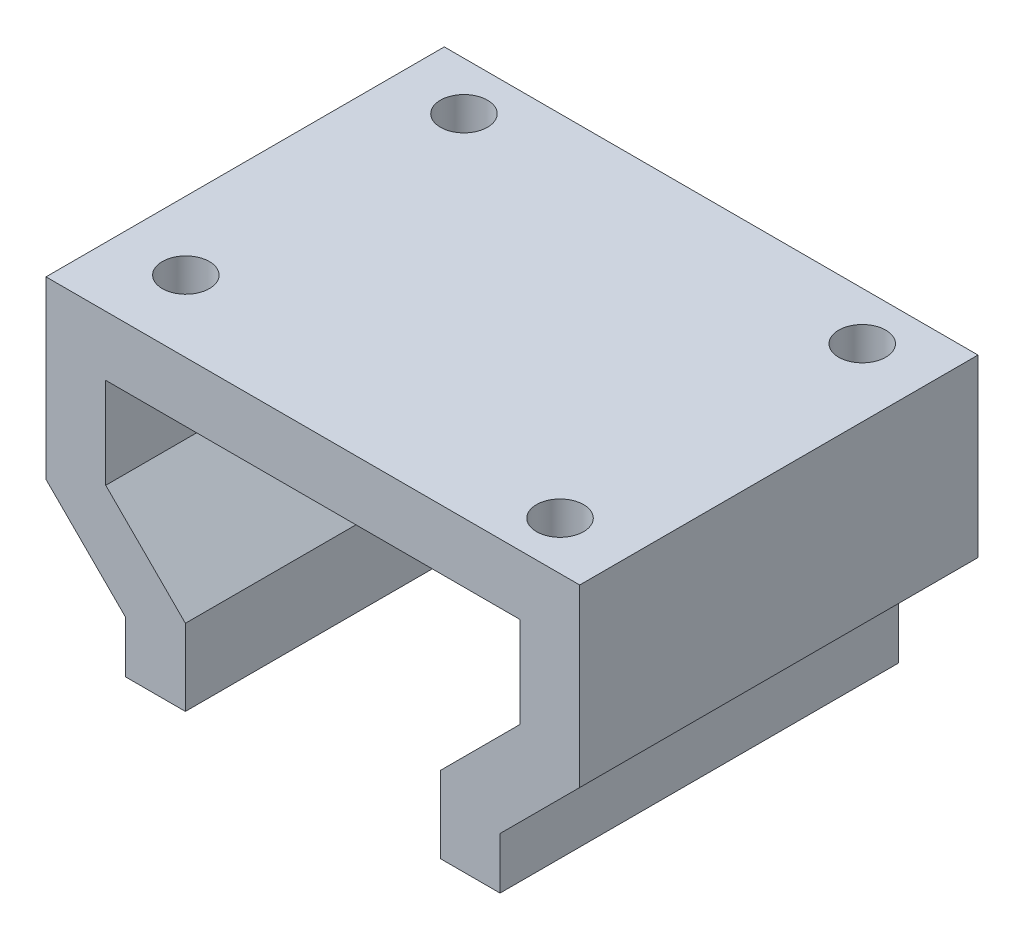
ISO-10303-21;
HEADER;
FILE_DESCRIPTION(('STEP AP214'),'2;1');
FILE_NAME('part.step','',(''),(''),'','','');
FILE_SCHEMA(('AUTOMOTIVE_DESIGN { 1 0 10303 214 1 1 1 1 }'));
ENDSEC;
DATA;
#1=APPLICATION_CONTEXT('core data for automotive mechanical design processes');
#2=APPLICATION_PROTOCOL_DEFINITION('international standard','automotive_design',2000,#1);
#3=PRODUCT_CONTEXT('',#1,'mechanical');
#4=PRODUCT('Part','Part','',(#3));
#5=PRODUCT_RELATED_PRODUCT_CATEGORY('part','',(#4));
#6=PRODUCT_DEFINITION_FORMATION('','',#4);
#7=PRODUCT_DEFINITION_CONTEXT('part definition',#1,'design');
#8=PRODUCT_DEFINITION('design','',#6,#7);
#9=PRODUCT_DEFINITION_SHAPE('','',#8);
#10=(LENGTH_UNIT() NAMED_UNIT(*) SI_UNIT(.MILLI.,.METRE.));
#11=(NAMED_UNIT(*) PLANE_ANGLE_UNIT() SI_UNIT($,.RADIAN.));
#12=(NAMED_UNIT(*) SI_UNIT($,.STERADIAN.) SOLID_ANGLE_UNIT());
#13=UNCERTAINTY_MEASURE_WITH_UNIT(LENGTH_MEASURE(1.E-05),#10,'distance_accuracy_value','');
#14=(GEOMETRIC_REPRESENTATION_CONTEXT(3) GLOBAL_UNCERTAINTY_ASSIGNED_CONTEXT((#13)) GLOBAL_UNIT_ASSIGNED_CONTEXT((#10,
#11,#12)) REPRESENTATION_CONTEXT('',''));
#15=CARTESIAN_POINT('',(0.,0.,0.));
#16=DIRECTION('',(0.,0.,1.));
#17=DIRECTION('',(1.,0.,0.));
#18=AXIS2_PLACEMENT_3D('',#15,#16,#17);
#19=CARTESIAN_POINT('',(-11.938,0.,25.4));
#20=DIRECTION('',(1.,0.,0.));
#21=DIRECTION('',(0.,1.,0.));
#22=AXIS2_PLACEMENT_3D('',#19,#20,#21);
#23=PLANE('',#22);
#24=DIRECTION('',(0.,-1.,0.));
#25=VECTOR('',#24,1.);
#26=CARTESIAN_POINT('',(-11.938,0.,0.));
#27=LINE('',#26,#25);
#28=CARTESIAN_POINT('',(-11.938,0.75142583767298,0.));
#29=VERTEX_POINT('',#28);
#30=CARTESIAN_POINT('',(-11.938,-2.54,0.));
#31=VERTEX_POINT('',#30);
#32=EDGE_CURVE('E194',#29,#31,#27,.T.);
#33=ORIENTED_EDGE('',*,*,#32,.T.);
#34=DIRECTION('',(0.,0.,-1.));
#35=VECTOR('',#34,1.);
#36=CARTESIAN_POINT('',(-11.938,-2.54,25.4));
#37=LINE('',#36,#35);
#38=CARTESIAN_POINT('',(-11.938,-2.54,25.4));
#39=VERTEX_POINT('',#38);
#40=EDGE_CURVE('E11',#39,#31,#37,.T.);
#41=ORIENTED_EDGE('',*,*,#40,.F.);
#42=DIRECTION('',(0.,-1.,0.));
#43=VECTOR('',#42,1.);
#44=CARTESIAN_POINT('',(-11.938,0.,25.4));
#45=LINE('',#44,#43);
#46=CARTESIAN_POINT('',(-11.938,0.75142583767298,25.4));
#47=VERTEX_POINT('',#46);
#48=EDGE_CURVE('E292',#47,#39,#45,.T.);
#49=ORIENTED_EDGE('',*,*,#48,.F.);
#50=DIRECTION('',(0.,0.,-1.));
#51=VECTOR('',#50,1.);
#52=CARTESIAN_POINT('',(-11.938,0.75142583767298,25.4));
#53=LINE('',#52,#51);
#54=EDGE_CURVE('E293',#47,#29,#53,.T.);
#55=ORIENTED_EDGE('',*,*,#54,.T.);
#56=EDGE_LOOP('',(#33,#41,#49,#55));
#57=FACE_BOUND('',#56,.T.);
#58=ADVANCED_FACE('F45',(#57),#23,.F.);
#59=CARTESIAN_POINT('',(0.,-2.54,25.4));
#60=DIRECTION('',(0.,1.,0.));
#61=DIRECTION('',(-1.,0.,0.));
#62=AXIS2_PLACEMENT_3D('',#59,#60,#61);
#63=PLANE('',#62);
#64=DIRECTION('',(1.,0.,0.));
#65=VECTOR('',#64,1.);
#66=CARTESIAN_POINT('',(0.,-2.54,0.));
#67=LINE('',#66,#65);
#68=CARTESIAN_POINT('',(-8.128,-2.54,0.));
#69=VERTEX_POINT('',#68);
#70=EDGE_CURVE('E236',#31,#69,#67,.T.);
#71=ORIENTED_EDGE('',*,*,#70,.T.);
#72=DIRECTION('',(0.,0.,-1.));
#73=VECTOR('',#72,1.);
#74=CARTESIAN_POINT('',(-8.128,-2.54,25.4));
#75=LINE('',#74,#73);
#76=CARTESIAN_POINT('',(-8.128,-2.54,25.4));
#77=VERTEX_POINT('',#76);
#78=EDGE_CURVE('E53',#77,#69,#75,.T.);
#79=ORIENTED_EDGE('',*,*,#78,.F.);
#80=DIRECTION('',(1.,0.,0.));
#81=VECTOR('',#80,1.);
#82=CARTESIAN_POINT('',(0.,-2.54,25.4));
#83=LINE('',#82,#81);
#84=EDGE_CURVE('E375',#39,#77,#83,.T.);
#85=ORIENTED_EDGE('',*,*,#84,.F.);
#86=ORIENTED_EDGE('',*,*,#40,.T.);
#87=EDGE_LOOP('',(#71,#79,#85,#86));
#88=FACE_BOUND('',#87,.T.);
#89=ADVANCED_FACE('F237',(#88),#63,.F.);
#90=CARTESIAN_POINT('',(-8.128,0.,25.4));
#91=DIRECTION('',(1.,0.,0.));
#92=DIRECTION('',(0.,1.,0.));
#93=AXIS2_PLACEMENT_3D('',#90,#91,#92);
#94=PLANE('',#93);
#95=DIRECTION('',(0.,-1.,0.));
#96=VECTOR('',#95,1.);
#97=CARTESIAN_POINT('',(-8.128,0.,0.));
#98=LINE('',#97,#96);
#99=CARTESIAN_POINT('',(-8.128,2.32957951031447,0.));
#100=VERTEX_POINT('',#99);
#101=EDGE_CURVE('E231',#100,#69,#98,.T.);
#102=ORIENTED_EDGE('',*,*,#101,.F.);
#103=DIRECTION('',(0.,0.,-1.));
#104=VECTOR('',#103,1.);
#105=CARTESIAN_POINT('',(-8.128,2.32957951031447,25.4));
#106=LINE('',#105,#104);
#107=CARTESIAN_POINT('',(-8.128,2.32957951031447,25.4));
#108=VERTEX_POINT('',#107);
#109=EDGE_CURVE('E221',#108,#100,#106,.T.);
#110=ORIENTED_EDGE('',*,*,#109,.F.);
#111=DIRECTION('',(0.,-1.,0.));
#112=VECTOR('',#111,1.);
#113=CARTESIAN_POINT('',(-8.128,0.,25.4));
#114=LINE('',#113,#112);
#115=EDGE_CURVE('E234',#108,#77,#114,.T.);
#116=ORIENTED_EDGE('',*,*,#115,.T.);
#117=ORIENTED_EDGE('',*,*,#78,.T.);
#118=EDGE_LOOP('',(#102,#110,#116,#117));
#119=FACE_BOUND('',#118,.T.);
#120=ADVANCED_FACE('F229',(#119),#94,.T.);
#121=CARTESIAN_POINT('',(-2.89921024484276,-2.89921024484276,25.4));
#122=DIRECTION('',(0.707106781186548,0.707106781186548,0.));
#123=DIRECTION('',(-0.707106781186548,0.707106781186548,0.));
#124=AXIS2_PLACEMENT_3D('',#121,#122,#123);
#125=PLANE('',#124);
#126=DIRECTION('',(0.707106781186548,-0.707106781186548,0.));
#127=VECTOR('',#126,1.);
#128=CARTESIAN_POINT('',(-2.89921024484276,-2.89921024484276,0.));
#129=LINE('',#128,#127);
#130=CARTESIAN_POINT('',(-13.208,7.40957951031447,0.));
#131=VERTEX_POINT('',#130);
#132=EDGE_CURVE('E248',#131,#100,#129,.T.);
#133=ORIENTED_EDGE('',*,*,#132,.F.);
#134=DIRECTION('',(0.,0.,-1.));
#135=VECTOR('',#134,1.);
#136=CARTESIAN_POINT('',(-13.208,7.40957951031447,25.4));
#137=LINE('',#136,#135);
#138=CARTESIAN_POINT('',(-13.208,7.40957951031447,25.4));
#139=VERTEX_POINT('',#138);
#140=EDGE_CURVE('E216',#139,#131,#137,.T.);
#141=ORIENTED_EDGE('',*,*,#140,.F.);
#142=DIRECTION('',(0.707106781186548,-0.707106781186548,0.));
#143=VECTOR('',#142,1.);
#144=CARTESIAN_POINT('',(-2.89921024484276,-2.89921024484276,25.4));
#145=LINE('',#144,#143);
#146=EDGE_CURVE('E381',#139,#108,#145,.T.);
#147=ORIENTED_EDGE('',*,*,#146,.T.);
#148=ORIENTED_EDGE('',*,*,#109,.T.);
#149=EDGE_LOOP('',(#133,#141,#147,#148));
#150=FACE_BOUND('',#149,.T.);
#151=ADVANCED_FACE('F484',(#150),#125,.T.);
#152=CARTESIAN_POINT('',(-13.208,0.,25.4));
#153=DIRECTION('',(1.,0.,0.));
#154=DIRECTION('',(0.,0.,-1.));
#155=AXIS2_PLACEMENT_3D('',#152,#153,#154);
#156=PLANE('',#155);
#157=DIRECTION('',(0.,-1.,0.));
#158=VECTOR('',#157,1.);
#159=CARTESIAN_POINT('',(-13.208,0.,0.));
#160=LINE('',#159,#158);
#161=CARTESIAN_POINT('',(-13.208,13.208,0.));
#162=VERTEX_POINT('',#161);
#163=EDGE_CURVE('E252',#162,#131,#160,.T.);
#164=ORIENTED_EDGE('',*,*,#163,.F.);
#165=DIRECTION('',(0.,0.,-1.));
#166=VECTOR('',#165,1.);
#167=CARTESIAN_POINT('',(-13.208,13.208,25.4));
#168=LINE('',#167,#166);
#169=CARTESIAN_POINT('',(-13.208,13.208,1.6526680616966));
#170=VERTEX_POINT('',#169);
#171=EDGE_CURVE('E201',#170,#162,#168,.T.);
#172=ORIENTED_EDGE('',*,*,#171,.F.);
#173=CARTESIAN_POINT('',(-13.208,13.208,4.47538731801665));
#174=VERTEX_POINT('',#173);
#175=EDGE_CURVE('E192',#174,#170,#168,.T.);
#176=ORIENTED_EDGE('',*,*,#175,.F.);
#177=CARTESIAN_POINT('',(-13.208,13.208,19.4491786997328));
#178=VERTEX_POINT('',#177);
#179=EDGE_CURVE('E200',#178,#174,#168,.T.);
#180=ORIENTED_EDGE('',*,*,#179,.F.);
#181=CARTESIAN_POINT('',(-13.208,13.208,22.2387684953691));
#182=VERTEX_POINT('',#181);
#183=EDGE_CURVE('E210',#182,#178,#168,.T.);
#184=ORIENTED_EDGE('',*,*,#183,.F.);
#185=CARTESIAN_POINT('',(-13.208,13.208,25.4));
#186=VERTEX_POINT('',#185);
#187=EDGE_CURVE('E212',#186,#182,#168,.T.);
#188=ORIENTED_EDGE('',*,*,#187,.F.);
#189=DIRECTION('',(0.,-1.,0.));
#190=VECTOR('',#189,1.);
#191=CARTESIAN_POINT('',(-13.208,0.,25.4));
#192=LINE('',#191,#190);
#193=EDGE_CURVE('E385',#186,#139,#192,.T.);
#194=ORIENTED_EDGE('',*,*,#193,.T.);
#195=ORIENTED_EDGE('',*,*,#140,.T.);
#196=EDGE_LOOP('',(#164,#172,#176,#180,#184,#188,#194,#195));
#197=FACE_BOUND('',#196,.T.);
#198=ADVANCED_FACE('F198',(#197),#156,.T.);
#199=CARTESIAN_POINT('',(0.,13.208,25.4));
#200=DIRECTION('',(0.,-1.,0.));
#201=DIRECTION('',(0.,0.,-1.));
#202=AXIS2_PLACEMENT_3D('',#199,#200,#201);
#203=PLANE('',#202);
#204=CARTESIAN_POINT('',(12.7,13.208,3.06402768985662));
#205=DIRECTION('',(0.,1.,0.));
#206=DIRECTION('',(0.,0.,1.));
#207=AXIS2_PLACEMENT_3D('',#204,#205,#206);
#208=CIRCLE('',#207,1.5);
#209=CARTESIAN_POINT('',(13.208,13.208,1.6526680616966));
#210=VERTEX_POINT('',#209);
#211=CARTESIAN_POINT('',(13.208,13.208,4.47538731801665));
#212=VERTEX_POINT('',#211);
#213=EDGE_CURVE('E356',#210,#212,#208,.T.);
#214=ORIENTED_EDGE('',*,*,#213,.T.);
#215=DIRECTION('',(0.,0.,-1.));
#216=VECTOR('',#215,1.);
#217=CARTESIAN_POINT('',(13.208,13.208,25.4));
#218=LINE('',#217,#216);
#219=CARTESIAN_POINT('',(13.208,13.208,20.9246126819834));
#220=VERTEX_POINT('',#219);
#221=EDGE_CURVE('E340',#220,#212,#218,.T.);
#222=ORIENTED_EDGE('',*,*,#221,.F.);
#223=CARTESIAN_POINT('',(12.7,13.208,22.3359723101434));
#224=DIRECTION('',(0.,1.,0.));
#225=DIRECTION('',(0.,0.,1.));
#226=AXIS2_PLACEMENT_3D('',#223,#224,#225);
#227=CIRCLE('',#226,1.5);
#228=CARTESIAN_POINT('',(13.208,13.208,23.7473319383034));
#229=VERTEX_POINT('',#228);
#230=EDGE_CURVE('E354',#220,#229,#227,.T.);
#231=ORIENTED_EDGE('',*,*,#230,.T.);
#232=CARTESIAN_POINT('',(13.208,13.208,25.4));
#233=VERTEX_POINT('',#232);
#234=EDGE_CURVE('E217',#233,#229,#218,.T.);
#235=ORIENTED_EDGE('',*,*,#234,.F.);
#236=DIRECTION('',(-1.,0.,0.));
#237=VECTOR('',#236,1.);
#238=CARTESIAN_POINT('',(0.,13.208,25.4));
#239=LINE('',#238,#237);
#240=EDGE_CURVE('E389',#233,#186,#239,.T.);
#241=ORIENTED_EDGE('',*,*,#240,.T.);
#242=ORIENTED_EDGE('',*,*,#187,.T.);
#243=CARTESIAN_POINT('',(-12.6561420535858,13.208,20.8439735975509));
#244=DIRECTION('',(0.,1.,0.));
#245=DIRECTION('',(0.,0.,1.));
#246=AXIS2_PLACEMENT_3D('',#243,#244,#245);
#247=CIRCLE('',#246,1.5);
#248=EDGE_CURVE('E208',#182,#178,#247,.T.);
#249=ORIENTED_EDGE('',*,*,#248,.T.);
#250=ORIENTED_EDGE('',*,*,#179,.T.);
#251=CARTESIAN_POINT('',(-12.7,13.208,3.06402768985662));
#252=DIRECTION('',(0.,1.,0.));
#253=DIRECTION('',(0.,0.,1.));
#254=AXIS2_PLACEMENT_3D('',#251,#252,#253);
#255=CIRCLE('',#254,1.5);
#256=EDGE_CURVE('E180',#174,#170,#255,.T.);
#257=ORIENTED_EDGE('',*,*,#256,.T.);
#258=ORIENTED_EDGE('',*,*,#171,.T.);
#259=DIRECTION('',(-1.,0.,0.));
#260=VECTOR('',#259,1.);
#261=CARTESIAN_POINT('',(0.,13.208,0.));
#262=LINE('',#261,#260);
#263=CARTESIAN_POINT('',(13.208,13.208,0.));
#264=VERTEX_POINT('',#263);
#265=EDGE_CURVE('E258',#264,#162,#262,.T.);
#266=ORIENTED_EDGE('',*,*,#265,.F.);
#267=EDGE_CURVE('E328',#210,#264,#218,.T.);
#268=ORIENTED_EDGE('',*,*,#267,.F.);
#269=EDGE_LOOP('',(#214,#222,#231,#235,#241,#242,#249,#250,#257,#258,#266,#268));
#270=FACE_BOUND('',#269,.T.);
#271=ADVANCED_FACE('F206',(#270),#203,.T.);
#272=CARTESIAN_POINT('',(13.208,0.,25.4));
#273=DIRECTION('',(1.,0.,0.));
#274=DIRECTION('',(0.,0.,-1.));
#275=AXIS2_PLACEMENT_3D('',#272,#273,#274);
#276=PLANE('',#275);
#277=DIRECTION('',(0.,-1.,0.));
#278=VECTOR('',#277,1.);
#279=CARTESIAN_POINT('',(13.208,0.,0.));
#280=LINE('',#279,#278);
#281=CARTESIAN_POINT('',(13.208,7.40957951031447,0.));
#282=VERTEX_POINT('',#281);
#283=EDGE_CURVE('E262',#264,#282,#280,.T.);
#284=ORIENTED_EDGE('',*,*,#283,.T.);
#285=DIRECTION('',(0.,0.,-1.));
#286=VECTOR('',#285,1.);
#287=CARTESIAN_POINT('',(13.208,7.40957951031447,25.4));
#288=LINE('',#287,#286);
#289=CARTESIAN_POINT('',(13.208,7.40957951031447,25.4));
#290=VERTEX_POINT('',#289);
#291=EDGE_CURVE('E325',#290,#282,#288,.T.);
#292=ORIENTED_EDGE('',*,*,#291,.F.);
#293=DIRECTION('',(0.,-1.,0.));
#294=VECTOR('',#293,1.);
#295=CARTESIAN_POINT('',(13.208,0.,25.4));
#296=LINE('',#295,#294);
#297=EDGE_CURVE('E393',#233,#290,#296,.T.);
#298=ORIENTED_EDGE('',*,*,#297,.F.);
#299=ORIENTED_EDGE('',*,*,#234,.T.);
#300=EDGE_CURVE('E343',#229,#220,#218,.T.);
#301=ORIENTED_EDGE('',*,*,#300,.T.);
#302=ORIENTED_EDGE('',*,*,#221,.T.);
#303=EDGE_CURVE('E334',#212,#210,#218,.T.);
#304=ORIENTED_EDGE('',*,*,#303,.T.);
#305=ORIENTED_EDGE('',*,*,#267,.T.);
#306=EDGE_LOOP('',(#284,#292,#298,#299,#301,#302,#304,#305));
#307=FACE_BOUND('',#306,.T.);
#308=ADVANCED_FACE('F351',(#307),#276,.F.);
#309=CARTESIAN_POINT('',(2.89921024484277,-2.89921024484277,25.4));
#310=DIRECTION('',(0.707106781186548,-0.707106781186548,0.));
#311=DIRECTION('',(0.707106781186548,0.707106781186548,0.));
#312=AXIS2_PLACEMENT_3D('',#309,#310,#311);
#313=PLANE('',#312);
#314=DIRECTION('',(-0.707106781186548,-0.707106781186548,0.));
#315=VECTOR('',#314,1.);
#316=CARTESIAN_POINT('',(2.89921024484277,-2.89921024484277,0.));
#317=LINE('',#316,#315);
#318=CARTESIAN_POINT('',(8.128,2.32957951031447,0.));
#319=VERTEX_POINT('',#318);
#320=EDGE_CURVE('E265',#282,#319,#317,.T.);
#321=ORIENTED_EDGE('',*,*,#320,.T.);
#322=DIRECTION('',(0.,0.,-1.));
#323=VECTOR('',#322,1.);
#324=CARTESIAN_POINT('',(8.128,2.32957951031447,25.4));
#325=LINE('',#324,#323);
#326=CARTESIAN_POINT('',(8.128,2.32957951031447,25.4));
#327=VERTEX_POINT('',#326);
#328=EDGE_CURVE('E322',#327,#319,#325,.T.);
#329=ORIENTED_EDGE('',*,*,#328,.F.);
#330=DIRECTION('',(-0.707106781186548,-0.707106781186548,0.));
#331=VECTOR('',#330,1.);
#332=CARTESIAN_POINT('',(2.89921024484277,-2.89921024484277,25.4));
#333=LINE('',#332,#331);
#334=EDGE_CURVE('E396',#290,#327,#333,.T.);
#335=ORIENTED_EDGE('',*,*,#334,.F.);
#336=ORIENTED_EDGE('',*,*,#291,.T.);
#337=EDGE_LOOP('',(#321,#329,#335,#336));
#338=FACE_BOUND('',#337,.T.);
#339=ADVANCED_FACE('F467',(#338),#313,.F.);
#340=CARTESIAN_POINT('',(8.12800000000001,0.,25.4));
#341=DIRECTION('',(1.,0.,0.));
#342=DIRECTION('',(0.,1.,0.));
#343=AXIS2_PLACEMENT_3D('',#340,#341,#342);
#344=PLANE('',#343);
#345=DIRECTION('',(0.,-1.,0.));
#346=VECTOR('',#345,1.);
#347=CARTESIAN_POINT('',(8.12800000000001,0.,0.));
#348=LINE('',#347,#346);
#349=CARTESIAN_POINT('',(8.12800000000001,-2.54,0.));
#350=VERTEX_POINT('',#349);
#351=EDGE_CURVE('E268',#319,#350,#348,.T.);
#352=ORIENTED_EDGE('',*,*,#351,.T.);
#353=DIRECTION('',(0.,0.,-1.));
#354=VECTOR('',#353,1.);
#355=CARTESIAN_POINT('',(8.12800000000001,-2.54,25.4));
#356=LINE('',#355,#354);
#357=CARTESIAN_POINT('',(8.12800000000001,-2.54,25.4));
#358=VERTEX_POINT('',#357);
#359=EDGE_CURVE('E318',#358,#350,#356,.T.);
#360=ORIENTED_EDGE('',*,*,#359,.F.);
#361=DIRECTION('',(0.,-1.,0.));
#362=VECTOR('',#361,1.);
#363=CARTESIAN_POINT('',(8.12800000000001,0.,25.4));
#364=LINE('',#363,#362);
#365=EDGE_CURVE('E399',#327,#358,#364,.T.);
#366=ORIENTED_EDGE('',*,*,#365,.F.);
#367=ORIENTED_EDGE('',*,*,#328,.T.);
#368=EDGE_LOOP('',(#352,#360,#366,#367));
#369=FACE_BOUND('',#368,.T.);
#370=ADVANCED_FACE('F466',(#369),#344,.F.);
#371=CARTESIAN_POINT('',(11.938,-2.54,0.));
#372=VERTEX_POINT('',#371);
#373=EDGE_CURVE('E244',#350,#372,#67,.T.);
#374=ORIENTED_EDGE('',*,*,#373,.T.);
#375=DIRECTION('',(0.,0.,-1.));
#376=VECTOR('',#375,1.);
#377=CARTESIAN_POINT('',(11.938,-2.54,25.4));
#378=LINE('',#377,#376);
#379=CARTESIAN_POINT('',(11.938,-2.54,25.4));
#380=VERTEX_POINT('',#379);
#381=EDGE_CURVE('E315',#380,#372,#378,.T.);
#382=ORIENTED_EDGE('',*,*,#381,.F.);
#383=EDGE_CURVE('E378',#358,#380,#83,.T.);
#384=ORIENTED_EDGE('',*,*,#383,.F.);
#385=ORIENTED_EDGE('',*,*,#359,.T.);
#386=EDGE_LOOP('',(#374,#382,#384,#385));
#387=FACE_BOUND('',#386,.T.);
#388=ADVANCED_FACE('F457',(#387),#63,.F.);
#389=CARTESIAN_POINT('',(11.938,0.,25.4));
#390=DIRECTION('',(1.,0.,0.));
#391=DIRECTION('',(0.,1.,0.));
#392=AXIS2_PLACEMENT_3D('',#389,#390,#391);
#393=PLANE('',#392);
#394=DIRECTION('',(0.,-1.,0.));
#395=VECTOR('',#394,1.);
#396=CARTESIAN_POINT('',(11.938,0.,0.));
#397=LINE('',#396,#395);
#398=CARTESIAN_POINT('',(11.938,0.75142583767298,0.));
#399=VERTEX_POINT('',#398);
#400=EDGE_CURVE('E271',#399,#372,#397,.T.);
#401=ORIENTED_EDGE('',*,*,#400,.F.);
#402=DIRECTION('',(0.,0.,-1.));
#403=VECTOR('',#402,1.);
#404=CARTESIAN_POINT('',(11.938,0.75142583767298,25.4));
#405=LINE('',#404,#403);
#406=CARTESIAN_POINT('',(11.938,0.75142583767298,25.4));
#407=VERTEX_POINT('',#406);
#408=EDGE_CURVE('E312',#407,#399,#405,.T.);
#409=ORIENTED_EDGE('',*,*,#408,.F.);
#410=DIRECTION('',(0.,-1.,0.));
#411=VECTOR('',#410,1.);
#412=CARTESIAN_POINT('',(11.938,0.,25.4));
#413=LINE('',#412,#411);
#414=EDGE_CURVE('E402',#407,#380,#413,.T.);
#415=ORIENTED_EDGE('',*,*,#414,.T.);
#416=ORIENTED_EDGE('',*,*,#381,.T.);
#417=EDGE_LOOP('',(#401,#409,#415,#416));
#418=FACE_BOUND('',#417,.T.);
#419=ADVANCED_FACE('F452',(#418),#393,.T.);
#420=CARTESIAN_POINT('',(5.59328708116351,-5.59328708116351,25.4));
#421=DIRECTION('',(0.707106781186548,-0.707106781186548,0.));
#422=DIRECTION('',(0.707106781186548,0.707106781186548,0.));
#423=AXIS2_PLACEMENT_3D('',#420,#421,#422);
#424=PLANE('',#423);
#425=DIRECTION('',(-0.707106781186548,-0.707106781186548,0.));
#426=VECTOR('',#425,1.);
#427=CARTESIAN_POINT('',(5.59328708116351,-5.59328708116351,0.));
#428=LINE('',#427,#426);
#429=CARTESIAN_POINT('',(17.018,5.83142583767298,0.));
#430=VERTEX_POINT('',#429);
#431=EDGE_CURVE('E275',#430,#399,#428,.T.);
#432=ORIENTED_EDGE('',*,*,#431,.F.);
#433=DIRECTION('',(0.,0.,-1.));
#434=VECTOR('',#433,1.);
#435=CARTESIAN_POINT('',(17.018,5.83142583767298,25.4));
#436=LINE('',#435,#434);
#437=CARTESIAN_POINT('',(17.018,5.83142583767298,25.4));
#438=VERTEX_POINT('',#437);
#439=EDGE_CURVE('E309',#438,#430,#436,.T.);
#440=ORIENTED_EDGE('',*,*,#439,.F.);
#441=DIRECTION('',(-0.707106781186548,-0.707106781186548,0.));
#442=VECTOR('',#441,1.);
#443=CARTESIAN_POINT('',(5.59328708116351,-5.59328708116351,25.4));
#444=LINE('',#443,#442);
#445=EDGE_CURVE('E406',#438,#407,#444,.T.);
#446=ORIENTED_EDGE('',*,*,#445,.T.);
#447=ORIENTED_EDGE('',*,*,#408,.T.);
#448=EDGE_LOOP('',(#432,#440,#446,#447));
#449=FACE_BOUND('',#448,.T.);
#450=ADVANCED_FACE('F446',(#449),#424,.T.);
#451=CARTESIAN_POINT('',(17.018,0.,25.4));
#452=DIRECTION('',(1.,0.,0.));
#453=DIRECTION('',(0.,0.,-1.));
#454=AXIS2_PLACEMENT_3D('',#451,#452,#453);
#455=PLANE('',#454);
#456=DIRECTION('',(0.,-1.,0.));
#457=VECTOR('',#456,1.);
#458=CARTESIAN_POINT('',(17.018,0.,0.));
#459=LINE('',#458,#457);
#460=CARTESIAN_POINT('',(17.018,17.018,0.));
#461=VERTEX_POINT('',#460);
#462=EDGE_CURVE('E279',#461,#430,#459,.T.);
#463=ORIENTED_EDGE('',*,*,#462,.F.);
#464=DIRECTION('',(0.,0.,-1.));
#465=VECTOR('',#464,1.);
#466=CARTESIAN_POINT('',(17.018,17.018,25.4));
#467=LINE('',#466,#465);
#468=CARTESIAN_POINT('',(17.018,17.018,25.4));
#469=VERTEX_POINT('',#468);
#470=EDGE_CURVE('E306',#469,#461,#467,.T.);
#471=ORIENTED_EDGE('',*,*,#470,.F.);
#472=DIRECTION('',(0.,-1.,0.));
#473=VECTOR('',#472,1.);
#474=CARTESIAN_POINT('',(17.018,0.,25.4));
#475=LINE('',#474,#473);
#476=EDGE_CURVE('E410',#469,#438,#475,.T.);
#477=ORIENTED_EDGE('',*,*,#476,.T.);
#478=ORIENTED_EDGE('',*,*,#439,.T.);
#479=EDGE_LOOP('',(#463,#471,#477,#478));
#480=FACE_BOUND('',#479,.T.);
#481=ADVANCED_FACE('F442',(#480),#455,.T.);
#482=CARTESIAN_POINT('',(0.,17.018,25.4));
#483=DIRECTION('',(0.,-1.,0.));
#484=DIRECTION('',(0.,0.,-1.));
#485=AXIS2_PLACEMENT_3D('',#482,#483,#484);
#486=PLANE('',#485);
#487=CARTESIAN_POINT('',(12.7,17.018,3.06402768985662));
#488=DIRECTION('',(0.,1.,0.));
#489=DIRECTION('',(0.,0.,1.));
#490=AXIS2_PLACEMENT_3D('',#487,#488,#489);
#491=CIRCLE('',#490,1.5);
#492=CARTESIAN_POINT('',(12.7,17.018,4.56402768985662));
#493=VERTEX_POINT('',#492);
#494=EDGE_CURVE('E364',#493,#493,#491,.T.);
#495=ORIENTED_EDGE('',*,*,#494,.F.);
#496=EDGE_LOOP('',(#495));
#497=FACE_BOUND('',#496,.T.);
#498=CARTESIAN_POINT('',(12.7,17.018,22.3359723101434));
#499=DIRECTION('',(0.,1.,0.));
#500=DIRECTION('',(0.,0.,1.));
#501=AXIS2_PLACEMENT_3D('',#498,#499,#500);
#502=CIRCLE('',#501,1.5);
#503=CARTESIAN_POINT('',(12.7,17.018,23.8359723101434));
#504=VERTEX_POINT('',#503);
#505=EDGE_CURVE('E544',#504,#504,#502,.T.);
#506=ORIENTED_EDGE('',*,*,#505,.F.);
#507=EDGE_LOOP('',(#506));
#508=FACE_BOUND('',#507,.T.);
#509=CARTESIAN_POINT('',(-12.6561420535858,17.018,20.8439735975509));
#510=DIRECTION('',(0.,1.,0.));
#511=DIRECTION('',(0.,0.,1.));
#512=AXIS2_PLACEMENT_3D('',#509,#510,#511);
#513=CIRCLE('',#512,1.5);
#514=CARTESIAN_POINT('',(-12.6561420535858,17.018,22.3439735975509));
#515=VERTEX_POINT('',#514);
#516=EDGE_CURVE('E371',#515,#515,#513,.T.);
#517=ORIENTED_EDGE('',*,*,#516,.F.);
#518=EDGE_LOOP('',(#517));
#519=FACE_BOUND('',#518,.T.);
#520=CARTESIAN_POINT('',(-12.7,17.018,3.06402768985662));
#521=DIRECTION('',(0.,1.,0.));
#522=DIRECTION('',(0.,0.,1.));
#523=AXIS2_PLACEMENT_3D('',#520,#521,#522);
#524=CIRCLE('',#523,1.5);
#525=CARTESIAN_POINT('',(-12.7,17.018,4.56402768985662));
#526=VERTEX_POINT('',#525);
#527=EDGE_CURVE('E187',#526,#526,#524,.T.);
#528=ORIENTED_EDGE('',*,*,#527,.F.);
#529=EDGE_LOOP('',(#528));
#530=FACE_BOUND('',#529,.T.);
#531=DIRECTION('',(-1.,0.,0.));
#532=VECTOR('',#531,1.);
#533=CARTESIAN_POINT('',(0.,17.018,0.));
#534=LINE('',#533,#532);
#535=CARTESIAN_POINT('',(-17.018,17.018,0.));
#536=VERTEX_POINT('',#535);
#537=EDGE_CURVE('E283',#461,#536,#534,.T.);
#538=ORIENTED_EDGE('',*,*,#537,.T.);
#539=DIRECTION('',(0.,0.,-1.));
#540=VECTOR('',#539,1.);
#541=CARTESIAN_POINT('',(-17.018,17.018,25.4));
#542=LINE('',#541,#540);
#543=CARTESIAN_POINT('',(-17.018,17.018,25.4));
#544=VERTEX_POINT('',#543);
#545=EDGE_CURVE('E302',#544,#536,#542,.T.);
#546=ORIENTED_EDGE('',*,*,#545,.F.);
#547=DIRECTION('',(-1.,0.,0.));
#548=VECTOR('',#547,1.);
#549=CARTESIAN_POINT('',(0.,17.018,25.4));
#550=LINE('',#549,#548);
#551=EDGE_CURVE('E414',#469,#544,#550,.T.);
#552=ORIENTED_EDGE('',*,*,#551,.F.);
#553=ORIENTED_EDGE('',*,*,#470,.T.);
#554=EDGE_LOOP('',(#538,#546,#552,#553));
#555=FACE_BOUND('',#554,.T.);
#556=ADVANCED_FACE('F438',(#497,#508,#519,#530,#555),#486,.F.);
#557=CARTESIAN_POINT('',(-17.018,0.,25.4));
#558=DIRECTION('',(1.,0.,0.));
#559=DIRECTION('',(0.,0.,-1.));
#560=AXIS2_PLACEMENT_3D('',#557,#558,#559);
#561=PLANE('',#560);
#562=DIRECTION('',(0.,-1.,0.));
#563=VECTOR('',#562,1.);
#564=CARTESIAN_POINT('',(-17.018,0.,0.));
#565=LINE('',#564,#563);
#566=CARTESIAN_POINT('',(-17.018,5.83142583767298,0.));
#567=VERTEX_POINT('',#566);
#568=EDGE_CURVE('E286',#536,#567,#565,.T.);
#569=ORIENTED_EDGE('',*,*,#568,.T.);
#570=DIRECTION('',(0.,0.,-1.));
#571=VECTOR('',#570,1.);
#572=CARTESIAN_POINT('',(-17.018,5.83142583767298,25.4));
#573=LINE('',#572,#571);
#574=CARTESIAN_POINT('',(-17.018,5.83142583767298,25.4));
#575=VERTEX_POINT('',#574);
#576=EDGE_CURVE('E297',#575,#567,#573,.T.);
#577=ORIENTED_EDGE('',*,*,#576,.F.);
#578=DIRECTION('',(0.,-1.,0.));
#579=VECTOR('',#578,1.);
#580=CARTESIAN_POINT('',(-17.018,0.,25.4));
#581=LINE('',#580,#579);
#582=EDGE_CURVE('E417',#544,#575,#581,.T.);
#583=ORIENTED_EDGE('',*,*,#582,.F.);
#584=ORIENTED_EDGE('',*,*,#545,.T.);
#585=EDGE_LOOP('',(#569,#577,#583,#584));
#586=FACE_BOUND('',#585,.T.);
#587=ADVANCED_FACE('F434',(#586),#561,.F.);
#588=CARTESIAN_POINT('',(-5.59328708116351,-5.59328708116351,25.4));
#589=DIRECTION('',(0.707106781186548,0.707106781186548,0.));
#590=DIRECTION('',(-0.707106781186548,0.707106781186548,0.));
#591=AXIS2_PLACEMENT_3D('',#588,#589,#590);
#592=PLANE('',#591);
#593=DIRECTION('',(0.707106781186548,-0.707106781186548,0.));
#594=VECTOR('',#593,1.);
#595=CARTESIAN_POINT('',(-5.59328708116351,-5.59328708116351,0.));
#596=LINE('',#595,#594);
#597=EDGE_CURVE('E289',#567,#29,#596,.T.);
#598=ORIENTED_EDGE('',*,*,#597,.T.);
#599=ORIENTED_EDGE('',*,*,#54,.F.);
#600=DIRECTION('',(0.707106781186548,-0.707106781186548,0.));
#601=VECTOR('',#600,1.);
#602=CARTESIAN_POINT('',(-5.59328708116351,-5.59328708116351,25.4));
#603=LINE('',#602,#601);
#604=EDGE_CURVE('E298',#575,#47,#603,.T.);
#605=ORIENTED_EDGE('',*,*,#604,.F.);
#606=ORIENTED_EDGE('',*,*,#576,.T.);
#607=EDGE_LOOP('',(#598,#599,#605,#606));
#608=FACE_BOUND('',#607,.T.);
#609=ADVANCED_FACE('F429',(#608),#592,.F.);
#610=CARTESIAN_POINT('',(0.,0.,25.4));
#611=DIRECTION('',(0.,0.,1.));
#612=DIRECTION('',(1.,0.,0.));
#613=AXIS2_PLACEMENT_3D('',#610,#611,#612);
#614=PLANE('',#613);
#615=ORIENTED_EDGE('',*,*,#48,.T.);
#616=ORIENTED_EDGE('',*,*,#84,.T.);
#617=ORIENTED_EDGE('',*,*,#115,.F.);
#618=ORIENTED_EDGE('',*,*,#146,.F.);
#619=ORIENTED_EDGE('',*,*,#193,.F.);
#620=ORIENTED_EDGE('',*,*,#240,.F.);
#621=ORIENTED_EDGE('',*,*,#297,.T.);
#622=ORIENTED_EDGE('',*,*,#334,.T.);
#623=ORIENTED_EDGE('',*,*,#365,.T.);
#624=ORIENTED_EDGE('',*,*,#383,.T.);
#625=ORIENTED_EDGE('',*,*,#414,.F.);
#626=ORIENTED_EDGE('',*,*,#445,.F.);
#627=ORIENTED_EDGE('',*,*,#476,.F.);
#628=ORIENTED_EDGE('',*,*,#551,.T.);
#629=ORIENTED_EDGE('',*,*,#582,.T.);
#630=ORIENTED_EDGE('',*,*,#604,.T.);
#631=EDGE_LOOP('',(#615,#616,#617,#618,#619,#620,#621,#622,#623,#624,#625,#626,#627,#628,#629,#630));
#632=FACE_BOUND('',#631,.T.);
#633=ADVANCED_FACE('F462',(#632),#614,.T.);
#634=CARTESIAN_POINT('',(0.,0.,0.));
#635=DIRECTION('',(0.,0.,1.));
#636=DIRECTION('',(1.,0.,0.));
#637=AXIS2_PLACEMENT_3D('',#634,#635,#636);
#638=PLANE('',#637);
#639=ORIENTED_EDGE('',*,*,#32,.F.);
#640=ORIENTED_EDGE('',*,*,#597,.F.);
#641=ORIENTED_EDGE('',*,*,#568,.F.);
#642=ORIENTED_EDGE('',*,*,#537,.F.);
#643=ORIENTED_EDGE('',*,*,#462,.T.);
#644=ORIENTED_EDGE('',*,*,#431,.T.);
#645=ORIENTED_EDGE('',*,*,#400,.T.);
#646=ORIENTED_EDGE('',*,*,#373,.F.);
#647=ORIENTED_EDGE('',*,*,#351,.F.);
#648=ORIENTED_EDGE('',*,*,#320,.F.);
#649=ORIENTED_EDGE('',*,*,#283,.F.);
#650=ORIENTED_EDGE('',*,*,#265,.T.);
#651=ORIENTED_EDGE('',*,*,#163,.T.);
#652=ORIENTED_EDGE('',*,*,#132,.T.);
#653=ORIENTED_EDGE('',*,*,#101,.T.);
#654=ORIENTED_EDGE('',*,*,#70,.F.);
#655=EDGE_LOOP('',(#639,#640,#641,#642,#643,#644,#645,#646,#647,#648,#649,#650,#651,#652,#653,#654));
#656=FACE_BOUND('',#655,.T.);
#657=ADVANCED_FACE('F245',(#656),#638,.F.);
#658=CARTESIAN_POINT('',(-12.7,13.208,3.06402768985662));
#659=DIRECTION('',(0.,1.,0.));
#660=DIRECTION('',(0.,0.,1.));
#661=AXIS2_PLACEMENT_3D('',#658,#659,#660);
#662=CYLINDRICAL_SURFACE('',#661,1.5);
#663=EDGE_CURVE('E59',#170,#174,#255,.T.);
#664=ORIENTED_EDGE('',*,*,#663,.F.);
#665=ORIENTED_EDGE('',*,*,#256,.F.);
#666=EDGE_LOOP('',(#664,#665));
#667=FACE_BOUND('',#666,.T.);
#668=ORIENTED_EDGE('',*,*,#527,.T.);
#669=EDGE_LOOP('',(#668));
#670=FACE_BOUND('',#669,.T.);
#671=ADVANCED_FACE('F181',(#667,#670),#662,.F.);
#672=CARTESIAN_POINT('',(-12.7,13.208,3.06402768985662));
#673=DIRECTION('',(0.,1.,0.));
#674=DIRECTION('',(0.,0.,1.));
#675=AXIS2_PLACEMENT_3D('',#672,#673,#674);
#676=PLANE('',#675);
#677=ORIENTED_EDGE('',*,*,#663,.T.);
#678=ORIENTED_EDGE('',*,*,#175,.T.);
#679=EDGE_LOOP('',(#677,#678));
#680=FACE_BOUND('',#679,.T.);
#681=ADVANCED_FACE('F191',(#680),#676,.T.);
#682=CARTESIAN_POINT('',(-12.6561420535858,13.208,20.8439735975509));
#683=DIRECTION('',(0.,1.,0.));
#684=DIRECTION('',(0.,0.,1.));
#685=AXIS2_PLACEMENT_3D('',#682,#683,#684);
#686=CYLINDRICAL_SURFACE('',#685,1.5);
#687=EDGE_CURVE('E66',#178,#182,#247,.T.);
#688=ORIENTED_EDGE('',*,*,#687,.F.);
#689=ORIENTED_EDGE('',*,*,#248,.F.);
#690=EDGE_LOOP('',(#688,#689));
#691=FACE_BOUND('',#690,.T.);
#692=ORIENTED_EDGE('',*,*,#516,.T.);
#693=EDGE_LOOP('',(#692));
#694=FACE_BOUND('',#693,.T.);
#695=ADVANCED_FACE('F512',(#691,#694),#686,.F.);
#696=CARTESIAN_POINT('',(-12.6561420535858,13.208,20.8439735975509));
#697=DIRECTION('',(0.,1.,0.));
#698=DIRECTION('',(0.,0.,1.));
#699=AXIS2_PLACEMENT_3D('',#696,#697,#698);
#700=PLANE('',#699);
#701=ORIENTED_EDGE('',*,*,#687,.T.);
#702=ORIENTED_EDGE('',*,*,#183,.T.);
#703=EDGE_LOOP('',(#701,#702));
#704=FACE_BOUND('',#703,.T.);
#705=ADVANCED_FACE('F524',(#704),#700,.T.);
#706=CARTESIAN_POINT('',(12.7,13.208,22.3359723101434));
#707=DIRECTION('',(0.,1.,0.));
#708=DIRECTION('',(0.,0.,1.));
#709=AXIS2_PLACEMENT_3D('',#706,#707,#708);
#710=PLANE('',#709);
#711=ORIENTED_EDGE('',*,*,#300,.F.);
#712=EDGE_CURVE('E547',#229,#220,#227,.T.);
#713=ORIENTED_EDGE('',*,*,#712,.T.);
#714=EDGE_LOOP('',(#711,#713));
#715=FACE_BOUND('',#714,.T.);
#716=ADVANCED_FACE('F521',(#715),#710,.T.);
#717=CARTESIAN_POINT('',(12.7,13.208,22.3359723101434));
#718=DIRECTION('',(0.,1.,0.));
#719=DIRECTION('',(0.,0.,1.));
#720=AXIS2_PLACEMENT_3D('',#717,#718,#719);
#721=CYLINDRICAL_SURFACE('',#720,1.5);
#722=ORIENTED_EDGE('',*,*,#712,.F.);
#723=ORIENTED_EDGE('',*,*,#230,.F.);
#724=EDGE_LOOP('',(#722,#723));
#725=FACE_BOUND('',#724,.T.);
#726=ORIENTED_EDGE('',*,*,#505,.T.);
#727=EDGE_LOOP('',(#726));
#728=FACE_BOUND('',#727,.T.);
#729=ADVANCED_FACE('F517',(#725,#728),#721,.F.);
#730=CARTESIAN_POINT('',(12.7,13.208,3.06402768985662));
#731=DIRECTION('',(0.,1.,0.));
#732=DIRECTION('',(0.,0.,1.));
#733=AXIS2_PLACEMENT_3D('',#730,#731,#732);
#734=PLANE('',#733);
#735=ORIENTED_EDGE('',*,*,#303,.F.);
#736=EDGE_CURVE('E361',#212,#210,#208,.T.);
#737=ORIENTED_EDGE('',*,*,#736,.T.);
#738=EDGE_LOOP('',(#735,#737));
#739=FACE_BOUND('',#738,.T.);
#740=ADVANCED_FACE('F513',(#739),#734,.T.);
#741=CARTESIAN_POINT('',(12.7,13.208,3.06402768985662));
#742=DIRECTION('',(0.,1.,0.));
#743=DIRECTION('',(0.,0.,1.));
#744=AXIS2_PLACEMENT_3D('',#741,#742,#743);
#745=CYLINDRICAL_SURFACE('',#744,1.5);
#746=ORIENTED_EDGE('',*,*,#736,.F.);
#747=ORIENTED_EDGE('',*,*,#213,.F.);
#748=EDGE_LOOP('',(#746,#747));
#749=FACE_BOUND('',#748,.T.);
#750=ORIENTED_EDGE('',*,*,#494,.T.);
#751=EDGE_LOOP('',(#750));
#752=FACE_BOUND('',#751,.T.);
#753=ADVANCED_FACE('F516',(#749,#752),#745,.F.);
#754=CLOSED_SHELL('',(#58,#89,#120,#151,#198,#271,#308,#339,#370,#388,#419,#450,#481,#556,#587,
#609,#633,#657,#671,#681,#695,#705,#716,#729,#740,#753));
#755=MANIFOLD_SOLID_BREP('B2',#754);
#756=ADVANCED_BREP_SHAPE_REPRESENTATION('',(#18,#755),#14);
#757=SHAPE_DEFINITION_REPRESENTATION(#9,#756);
ENDSEC;
END-ISO-10303-21;
